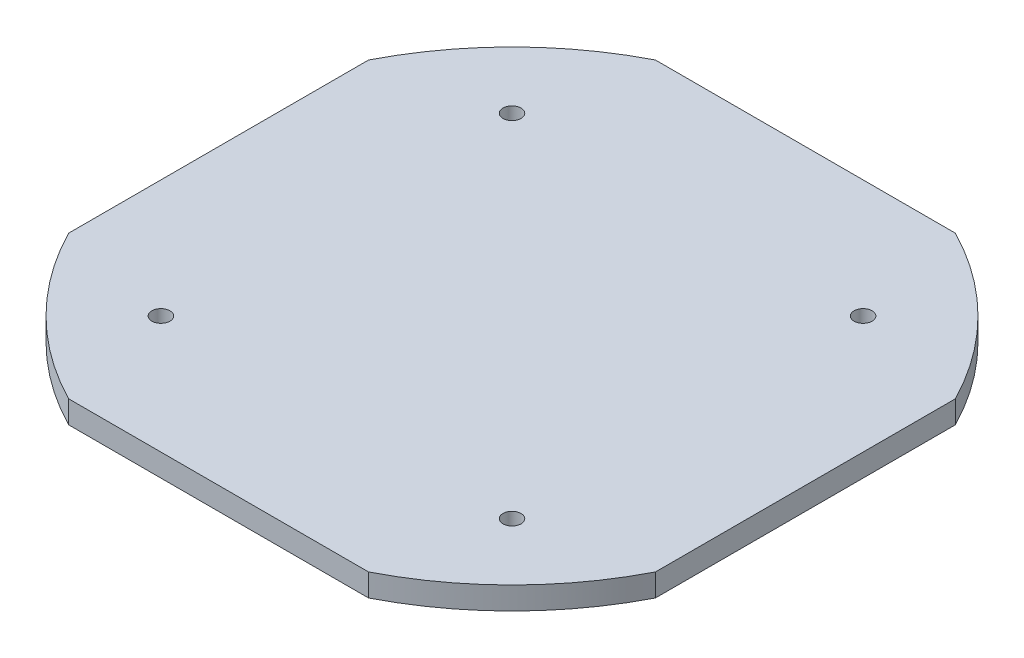
ISO-10303-21;
HEADER;
FILE_DESCRIPTION(('STEP AP214'),'2;1');
FILE_NAME('part.step','',(''),(''),'','','');
FILE_SCHEMA(('AUTOMOTIVE_DESIGN { 1 0 10303 214 1 1 1 1 }'));
ENDSEC;
DATA;
#1=APPLICATION_CONTEXT('core data for automotive mechanical design processes');
#2=APPLICATION_PROTOCOL_DEFINITION('international standard','automotive_design',2000,#1);
#3=PRODUCT_CONTEXT('',#1,'mechanical');
#4=PRODUCT('Part','Part','',(#3));
#5=PRODUCT_RELATED_PRODUCT_CATEGORY('part','',(#4));
#6=PRODUCT_DEFINITION_FORMATION('','',#4);
#7=PRODUCT_DEFINITION_CONTEXT('part definition',#1,'design');
#8=PRODUCT_DEFINITION('design','',#6,#7);
#9=PRODUCT_DEFINITION_SHAPE('','',#8);
#10=(LENGTH_UNIT() NAMED_UNIT(*) SI_UNIT(.MILLI.,.METRE.));
#11=(NAMED_UNIT(*) PLANE_ANGLE_UNIT() SI_UNIT($,.RADIAN.));
#12=(NAMED_UNIT(*) SI_UNIT($,.STERADIAN.) SOLID_ANGLE_UNIT());
#13=UNCERTAINTY_MEASURE_WITH_UNIT(LENGTH_MEASURE(1.E-05),#10,'distance_accuracy_value','');
#14=(GEOMETRIC_REPRESENTATION_CONTEXT(3) GLOBAL_UNCERTAINTY_ASSIGNED_CONTEXT((#13)) GLOBAL_UNIT_ASSIGNED_CONTEXT((#10,
#11,#12)) REPRESENTATION_CONTEXT('',''));
#15=CARTESIAN_POINT('',(0.,0.,0.));
#16=DIRECTION('',(0.,0.,1.));
#17=DIRECTION('',(1.,0.,0.));
#18=AXIS2_PLACEMENT_3D('',#15,#16,#17);
#19=CARTESIAN_POINT('',(0.,5.,0.));
#20=DIRECTION('',(0.,-1.,0.));
#21=DIRECTION('',(0.,0.,-1.));
#22=AXIS2_PLACEMENT_3D('',#19,#20,#21);
#23=CYLINDRICAL_SURFACE('',#22,73.);
#24=CARTESIAN_POINT('',(0.,0.,0.));
#25=DIRECTION('',(0.,1.,0.));
#26=DIRECTION('',(0.,0.,1.));
#27=AXIS2_PLACEMENT_3D('',#24,#25,#26);
#28=CIRCLE('',#27,73.);
#29=CARTESIAN_POINT('',(33.2264954516723,0.,65.));
#30=VERTEX_POINT('',#29);
#31=CARTESIAN_POINT('',(65.,0.,33.2264954516723));
#32=VERTEX_POINT('',#31);
#33=EDGE_CURVE('E133',#30,#32,#28,.T.);
#34=ORIENTED_EDGE('',*,*,#33,.T.);
#35=DIRECTION('',(0.,-1.,0.));
#36=VECTOR('',#35,1.);
#37=CARTESIAN_POINT('',(65.,5.,33.2264954516723));
#38=LINE('',#37,#36);
#39=CARTESIAN_POINT('',(65.,5.,33.2264954516723));
#40=VERTEX_POINT('',#39);
#41=EDGE_CURVE('E11',#40,#32,#38,.T.);
#42=ORIENTED_EDGE('',*,*,#41,.F.);
#43=CARTESIAN_POINT('',(0.,5.,0.));
#44=DIRECTION('',(0.,1.,0.));
#45=DIRECTION('',(0.,0.,1.));
#46=AXIS2_PLACEMENT_3D('',#43,#44,#45);
#47=CIRCLE('',#46,73.);
#48=CARTESIAN_POINT('',(33.2264954516723,5.,65.));
#49=VERTEX_POINT('',#48);
#50=EDGE_CURVE('E148',#49,#40,#47,.T.);
#51=ORIENTED_EDGE('',*,*,#50,.F.);
#52=DIRECTION('',(0.,-1.,0.));
#53=VECTOR('',#52,1.);
#54=CARTESIAN_POINT('',(33.2264954516723,5.,65.));
#55=LINE('',#54,#53);
#56=EDGE_CURVE('E129',#49,#30,#55,.T.);
#57=ORIENTED_EDGE('',*,*,#56,.T.);
#58=EDGE_LOOP('',(#34,#42,#51,#57));
#59=FACE_BOUND('',#58,.T.);
#60=ADVANCED_FACE('F37',(#59),#23,.T.);
#61=CARTESIAN_POINT('',(65.,5.,-33.2264954516723));
#62=DIRECTION('',(-1.,0.,0.));
#63=DIRECTION('',(0.,0.,1.));
#64=AXIS2_PLACEMENT_3D('',#61,#62,#63);
#65=PLANE('',#64);
#66=DIRECTION('',(0.,0.,-1.));
#67=VECTOR('',#66,1.);
#68=CARTESIAN_POINT('',(65.,0.,-33.2264954516723));
#69=LINE('',#68,#67);
#70=CARTESIAN_POINT('',(65.,0.,-33.2264954516723));
#71=VERTEX_POINT('',#70);
#72=EDGE_CURVE('E136',#32,#71,#69,.T.);
#73=ORIENTED_EDGE('',*,*,#72,.T.);
#74=DIRECTION('',(0.,-1.,0.));
#75=VECTOR('',#74,1.);
#76=CARTESIAN_POINT('',(65.,5.,-33.2264954516723));
#77=LINE('',#76,#75);
#78=CARTESIAN_POINT('',(65.,5.,-33.2264954516723));
#79=VERTEX_POINT('',#78);
#80=EDGE_CURVE('E45',#79,#71,#77,.T.);
#81=ORIENTED_EDGE('',*,*,#80,.F.);
#82=DIRECTION('',(0.,0.,-1.));
#83=VECTOR('',#82,1.);
#84=CARTESIAN_POINT('',(65.,5.,-33.2264954516723));
#85=LINE('',#84,#83);
#86=EDGE_CURVE('E96',#40,#79,#85,.T.);
#87=ORIENTED_EDGE('',*,*,#86,.F.);
#88=ORIENTED_EDGE('',*,*,#41,.T.);
#89=EDGE_LOOP('',(#73,#81,#87,#88));
#90=FACE_BOUND('',#89,.T.);
#91=ADVANCED_FACE('F233',(#90),#65,.F.);
#92=CARTESIAN_POINT('',(0.,5.,0.));
#93=DIRECTION('',(0.,-1.,0.));
#94=DIRECTION('',(0.,0.,-1.));
#95=AXIS2_PLACEMENT_3D('',#92,#93,#94);
#96=CYLINDRICAL_SURFACE('',#95,73.);
#97=CARTESIAN_POINT('',(0.,0.,0.));
#98=DIRECTION('',(0.,1.,0.));
#99=DIRECTION('',(0.,0.,1.));
#100=AXIS2_PLACEMENT_3D('',#97,#98,#99);
#101=CIRCLE('',#100,73.);
#102=CARTESIAN_POINT('',(33.2264954516723,0.,-65.));
#103=VERTEX_POINT('',#102);
#104=EDGE_CURVE('E139',#71,#103,#101,.T.);
#105=ORIENTED_EDGE('',*,*,#104,.T.);
#106=DIRECTION('',(0.,-1.,0.));
#107=VECTOR('',#106,1.);
#108=CARTESIAN_POINT('',(33.2264954516723,5.,-65.));
#109=LINE('',#108,#107);
#110=CARTESIAN_POINT('',(33.2264954516723,5.,-65.));
#111=VERTEX_POINT('',#110);
#112=EDGE_CURVE('E155',#111,#103,#109,.T.);
#113=ORIENTED_EDGE('',*,*,#112,.F.);
#114=CARTESIAN_POINT('',(0.,5.,0.));
#115=DIRECTION('',(0.,1.,0.));
#116=DIRECTION('',(0.,0.,1.));
#117=AXIS2_PLACEMENT_3D('',#114,#115,#116);
#118=CIRCLE('',#117,73.);
#119=EDGE_CURVE('E163',#79,#111,#118,.T.);
#120=ORIENTED_EDGE('',*,*,#119,.F.);
#121=ORIENTED_EDGE('',*,*,#80,.T.);
#122=EDGE_LOOP('',(#105,#113,#120,#121));
#123=FACE_BOUND('',#122,.T.);
#124=ADVANCED_FACE('F161',(#123),#96,.T.);
#125=CARTESIAN_POINT('',(-33.2264954516723,5.,-65.));
#126=DIRECTION('',(0.,0.,1.));
#127=DIRECTION('',(1.,0.,0.));
#128=AXIS2_PLACEMENT_3D('',#125,#126,#127);
#129=PLANE('',#128);
#130=DIRECTION('',(-1.,0.,0.));
#131=VECTOR('',#130,1.);
#132=CARTESIAN_POINT('',(-33.2264954516723,0.,-65.));
#133=LINE('',#132,#131);
#134=CARTESIAN_POINT('',(-33.2264954516723,0.,-65.));
#135=VERTEX_POINT('',#134);
#136=EDGE_CURVE('E141',#103,#135,#133,.T.);
#137=ORIENTED_EDGE('',*,*,#136,.T.);
#138=DIRECTION('',(0.,-1.,0.));
#139=VECTOR('',#138,1.);
#140=CARTESIAN_POINT('',(-33.2264954516723,5.,-65.));
#141=LINE('',#140,#139);
#142=CARTESIAN_POINT('',(-33.2264954516723,5.,-65.));
#143=VERTEX_POINT('',#142);
#144=EDGE_CURVE('E152',#143,#135,#141,.T.);
#145=ORIENTED_EDGE('',*,*,#144,.F.);
#146=DIRECTION('',(-1.,0.,0.));
#147=VECTOR('',#146,1.);
#148=CARTESIAN_POINT('',(-33.2264954516723,5.,-65.));
#149=LINE('',#148,#147);
#150=EDGE_CURVE('E175',#111,#143,#149,.T.);
#151=ORIENTED_EDGE('',*,*,#150,.F.);
#152=ORIENTED_EDGE('',*,*,#112,.T.);
#153=EDGE_LOOP('',(#137,#145,#151,#152));
#154=FACE_BOUND('',#153,.T.);
#155=ADVANCED_FACE('F171',(#154),#129,.F.);
#156=CARTESIAN_POINT('',(0.,5.,0.));
#157=DIRECTION('',(0.,-1.,0.));
#158=DIRECTION('',(0.,0.,-1.));
#159=AXIS2_PLACEMENT_3D('',#156,#157,#158);
#160=CYLINDRICAL_SURFACE('',#159,73.);
#161=CARTESIAN_POINT('',(0.,0.,0.));
#162=DIRECTION('',(0.,1.,0.));
#163=DIRECTION('',(0.,0.,1.));
#164=AXIS2_PLACEMENT_3D('',#161,#162,#163);
#165=CIRCLE('',#164,73.);
#166=CARTESIAN_POINT('',(-65.,0.,-33.2264954516723));
#167=VERTEX_POINT('',#166);
#168=EDGE_CURVE('E143',#135,#167,#165,.T.);
#169=ORIENTED_EDGE('',*,*,#168,.T.);
#170=DIRECTION('',(0.,-1.,0.));
#171=VECTOR('',#170,1.);
#172=CARTESIAN_POINT('',(-65.,5.,-33.2264954516723));
#173=LINE('',#172,#171);
#174=CARTESIAN_POINT('',(-65.,5.,-33.2264954516723));
#175=VERTEX_POINT('',#174);
#176=EDGE_CURVE('E124',#175,#167,#173,.T.);
#177=ORIENTED_EDGE('',*,*,#176,.F.);
#178=CARTESIAN_POINT('',(0.,5.,0.));
#179=DIRECTION('',(0.,1.,0.));
#180=DIRECTION('',(0.,0.,1.));
#181=AXIS2_PLACEMENT_3D('',#178,#179,#180);
#182=CIRCLE('',#181,73.);
#183=EDGE_CURVE('E115',#143,#175,#182,.T.);
#184=ORIENTED_EDGE('',*,*,#183,.F.);
#185=ORIENTED_EDGE('',*,*,#144,.T.);
#186=EDGE_LOOP('',(#169,#177,#184,#185));
#187=FACE_BOUND('',#186,.T.);
#188=ADVANCED_FACE('F174',(#187),#160,.T.);
#189=CARTESIAN_POINT('',(-65.,5.,33.2264954516723));
#190=DIRECTION('',(1.,0.,0.));
#191=DIRECTION('',(0.,0.,-1.));
#192=AXIS2_PLACEMENT_3D('',#189,#190,#191);
#193=PLANE('',#192);
#194=DIRECTION('',(0.,0.,1.));
#195=VECTOR('',#194,1.);
#196=CARTESIAN_POINT('',(-65.,0.,33.2264954516723));
#197=LINE('',#196,#195);
#198=CARTESIAN_POINT('',(-65.,0.,33.2264954516723));
#199=VERTEX_POINT('',#198);
#200=EDGE_CURVE('E123',#167,#199,#197,.T.);
#201=ORIENTED_EDGE('',*,*,#200,.T.);
#202=DIRECTION('',(0.,-1.,0.));
#203=VECTOR('',#202,1.);
#204=CARTESIAN_POINT('',(-65.,5.,33.2264954516723));
#205=LINE('',#204,#203);
#206=CARTESIAN_POINT('',(-65.,5.,33.2264954516723));
#207=VERTEX_POINT('',#206);
#208=EDGE_CURVE('E120',#207,#199,#205,.T.);
#209=ORIENTED_EDGE('',*,*,#208,.F.);
#210=DIRECTION('',(0.,0.,1.));
#211=VECTOR('',#210,1.);
#212=CARTESIAN_POINT('',(-65.,5.,33.2264954516723));
#213=LINE('',#212,#211);
#214=EDGE_CURVE('E109',#175,#207,#213,.T.);
#215=ORIENTED_EDGE('',*,*,#214,.F.);
#216=ORIENTED_EDGE('',*,*,#176,.T.);
#217=EDGE_LOOP('',(#201,#209,#215,#216));
#218=FACE_BOUND('',#217,.T.);
#219=ADVANCED_FACE('F121',(#218),#193,.F.);
#220=CARTESIAN_POINT('',(0.,5.,0.));
#221=DIRECTION('',(0.,-1.,0.));
#222=DIRECTION('',(0.,0.,-1.));
#223=AXIS2_PLACEMENT_3D('',#220,#221,#222);
#224=CYLINDRICAL_SURFACE('',#223,73.);
#225=CARTESIAN_POINT('',(0.,0.,0.));
#226=DIRECTION('',(0.,1.,0.));
#227=DIRECTION('',(0.,0.,1.));
#228=AXIS2_PLACEMENT_3D('',#225,#226,#227);
#229=CIRCLE('',#228,73.);
#230=CARTESIAN_POINT('',(-33.2264954516723,0.,65.));
#231=VERTEX_POINT('',#230);
#232=EDGE_CURVE('E82',#199,#231,#229,.T.);
#233=ORIENTED_EDGE('',*,*,#232,.T.);
#234=DIRECTION('',(0.,-1.,0.));
#235=VECTOR('',#234,1.);
#236=CARTESIAN_POINT('',(-33.2264954516723,5.,65.));
#237=LINE('',#236,#235);
#238=CARTESIAN_POINT('',(-33.2264954516723,5.,65.));
#239=VERTEX_POINT('',#238);
#240=EDGE_CURVE('E125',#239,#231,#237,.T.);
#241=ORIENTED_EDGE('',*,*,#240,.F.);
#242=CARTESIAN_POINT('',(0.,5.,0.));
#243=DIRECTION('',(0.,1.,0.));
#244=DIRECTION('',(0.,0.,1.));
#245=AXIS2_PLACEMENT_3D('',#242,#243,#244);
#246=CIRCLE('',#245,73.);
#247=EDGE_CURVE('E113',#207,#239,#246,.T.);
#248=ORIENTED_EDGE('',*,*,#247,.F.);
#249=ORIENTED_EDGE('',*,*,#208,.T.);
#250=EDGE_LOOP('',(#233,#241,#248,#249));
#251=FACE_BOUND('',#250,.T.);
#252=ADVANCED_FACE('F127',(#251),#224,.T.);
#253=CARTESIAN_POINT('',(33.2264954516723,5.,65.));
#254=DIRECTION('',(0.,0.,-1.));
#255=DIRECTION('',(-1.,0.,0.));
#256=AXIS2_PLACEMENT_3D('',#253,#254,#255);
#257=PLANE('',#256);
#258=DIRECTION('',(1.,0.,0.));
#259=VECTOR('',#258,1.);
#260=CARTESIAN_POINT('',(33.2264954516723,0.,65.));
#261=LINE('',#260,#259);
#262=EDGE_CURVE('E88',#231,#30,#261,.T.);
#263=ORIENTED_EDGE('',*,*,#262,.T.);
#264=ORIENTED_EDGE('',*,*,#56,.F.);
#265=DIRECTION('',(1.,0.,0.));
#266=VECTOR('',#265,1.);
#267=CARTESIAN_POINT('',(33.2264954516723,5.,65.));
#268=LINE('',#267,#266);
#269=EDGE_CURVE('E53',#239,#49,#268,.T.);
#270=ORIENTED_EDGE('',*,*,#269,.F.);
#271=ORIENTED_EDGE('',*,*,#240,.T.);
#272=EDGE_LOOP('',(#263,#264,#270,#271));
#273=FACE_BOUND('',#272,.T.);
#274=ADVANCED_FACE('F209',(#273),#257,.F.);
#275=CARTESIAN_POINT('',(0.,5.,0.));
#276=DIRECTION('',(0.,1.,0.));
#277=DIRECTION('',(0.,0.,1.));
#278=AXIS2_PLACEMENT_3D('',#275,#276,#277);
#279=PLANE('',#278);
#280=CARTESIAN_POINT('',(38.8908729652599,5.,-38.8908729652603));
#281=DIRECTION('',(0.,1.,0.));
#282=DIRECTION('',(0.,0.,1.));
#283=AXIS2_PLACEMENT_3D('',#280,#281,#282);
#284=CIRCLE('',#283,1.99999999999999);
#285=CARTESIAN_POINT('',(38.8908729652599,5.,-36.8908729652603));
#286=VERTEX_POINT('',#285);
#287=EDGE_CURVE('E201',#286,#286,#284,.T.);
#288=ORIENTED_EDGE('',*,*,#287,.F.);
#289=EDGE_LOOP('',(#288));
#290=FACE_BOUND('',#289,.T.);
#291=CARTESIAN_POINT('',(38.8908729652603,5.,38.8908729652599));
#292=DIRECTION('',(0.,1.,0.));
#293=DIRECTION('',(0.,0.,1.));
#294=AXIS2_PLACEMENT_3D('',#291,#292,#293);
#295=CIRCLE('',#294,1.99999999999999);
#296=CARTESIAN_POINT('',(38.8908729652603,5.,40.8908729652599));
#297=VERTEX_POINT('',#296);
#298=EDGE_CURVE('E195',#297,#297,#295,.T.);
#299=ORIENTED_EDGE('',*,*,#298,.F.);
#300=EDGE_LOOP('',(#299));
#301=FACE_BOUND('',#300,.T.);
#302=CARTESIAN_POINT('',(-38.8908729652599,5.,38.8908729652603));
#303=DIRECTION('',(0.,1.,0.));
#304=DIRECTION('',(0.,0.,1.));
#305=AXIS2_PLACEMENT_3D('',#302,#303,#304);
#306=CIRCLE('',#305,1.99999999999999);
#307=CARTESIAN_POINT('',(-38.8908729652599,5.,40.8908729652603));
#308=VERTEX_POINT('',#307);
#309=EDGE_CURVE('E189',#308,#308,#306,.T.);
#310=ORIENTED_EDGE('',*,*,#309,.F.);
#311=EDGE_LOOP('',(#310));
#312=FACE_BOUND('',#311,.T.);
#313=CARTESIAN_POINT('',(-38.8908729652603,5.,-38.8908729652599));
#314=DIRECTION('',(0.,1.,0.));
#315=DIRECTION('',(0.,0.,1.));
#316=AXIS2_PLACEMENT_3D('',#313,#314,#315);
#317=CIRCLE('',#316,1.99999999999999);
#318=CARTESIAN_POINT('',(-38.8908729652603,5.,-36.8908729652599));
#319=VERTEX_POINT('',#318);
#320=EDGE_CURVE('E183',#319,#319,#317,.T.);
#321=ORIENTED_EDGE('',*,*,#320,.F.);
#322=EDGE_LOOP('',(#321));
#323=FACE_BOUND('',#322,.T.);
#324=ORIENTED_EDGE('',*,*,#50,.T.);
#325=ORIENTED_EDGE('',*,*,#86,.T.);
#326=ORIENTED_EDGE('',*,*,#119,.T.);
#327=ORIENTED_EDGE('',*,*,#150,.T.);
#328=ORIENTED_EDGE('',*,*,#183,.T.);
#329=ORIENTED_EDGE('',*,*,#214,.T.);
#330=ORIENTED_EDGE('',*,*,#247,.T.);
#331=ORIENTED_EDGE('',*,*,#269,.T.);
#332=EDGE_LOOP('',(#324,#325,#326,#327,#328,#329,#330,#331));
#333=FACE_BOUND('',#332,.T.);
#334=ADVANCED_FACE('F111',(#290,#301,#312,#323,#333),#279,.T.);
#335=CARTESIAN_POINT('',(0.,0.,0.));
#336=DIRECTION('',(0.,1.,0.));
#337=DIRECTION('',(0.,0.,1.));
#338=AXIS2_PLACEMENT_3D('',#335,#336,#337);
#339=PLANE('',#338);
#340=CARTESIAN_POINT('',(38.8908729652599,0.,-38.8908729652603));
#341=DIRECTION('',(0.,1.,0.));
#342=DIRECTION('',(0.,0.,1.));
#343=AXIS2_PLACEMENT_3D('',#340,#341,#342);
#344=CIRCLE('',#343,1.99999999999999);
#345=CARTESIAN_POINT('',(38.8908729652599,0.,-36.8908729652603));
#346=VERTEX_POINT('',#345);
#347=EDGE_CURVE('E198',#346,#346,#344,.T.);
#348=ORIENTED_EDGE('',*,*,#347,.T.);
#349=EDGE_LOOP('',(#348));
#350=FACE_BOUND('',#349,.T.);
#351=CARTESIAN_POINT('',(38.8908729652603,0.,38.8908729652599));
#352=DIRECTION('',(0.,1.,0.));
#353=DIRECTION('',(0.,0.,1.));
#354=AXIS2_PLACEMENT_3D('',#351,#352,#353);
#355=CIRCLE('',#354,1.99999999999999);
#356=CARTESIAN_POINT('',(38.8908729652603,0.,40.8908729652599));
#357=VERTEX_POINT('',#356);
#358=EDGE_CURVE('E192',#357,#357,#355,.T.);
#359=ORIENTED_EDGE('',*,*,#358,.T.);
#360=EDGE_LOOP('',(#359));
#361=FACE_BOUND('',#360,.T.);
#362=CARTESIAN_POINT('',(-38.8908729652599,0.,38.8908729652603));
#363=DIRECTION('',(0.,1.,0.));
#364=DIRECTION('',(0.,0.,1.));
#365=AXIS2_PLACEMENT_3D('',#362,#363,#364);
#366=CIRCLE('',#365,1.99999999999999);
#367=CARTESIAN_POINT('',(-38.8908729652599,0.,40.8908729652603));
#368=VERTEX_POINT('',#367);
#369=EDGE_CURVE('E186',#368,#368,#366,.T.);
#370=ORIENTED_EDGE('',*,*,#369,.T.);
#371=EDGE_LOOP('',(#370));
#372=FACE_BOUND('',#371,.T.);
#373=CARTESIAN_POINT('',(-38.8908729652603,0.,-38.8908729652599));
#374=DIRECTION('',(0.,1.,0.));
#375=DIRECTION('',(0.,0.,1.));
#376=AXIS2_PLACEMENT_3D('',#373,#374,#375);
#377=CIRCLE('',#376,1.99999999999999);
#378=CARTESIAN_POINT('',(-38.8908729652603,0.,-36.8908729652599));
#379=VERTEX_POINT('',#378);
#380=EDGE_CURVE('E137',#379,#379,#377,.T.);
#381=ORIENTED_EDGE('',*,*,#380,.T.);
#382=EDGE_LOOP('',(#381));
#383=FACE_BOUND('',#382,.T.);
#384=ORIENTED_EDGE('',*,*,#33,.F.);
#385=ORIENTED_EDGE('',*,*,#262,.F.);
#386=ORIENTED_EDGE('',*,*,#232,.F.);
#387=ORIENTED_EDGE('',*,*,#200,.F.);
#388=ORIENTED_EDGE('',*,*,#168,.F.);
#389=ORIENTED_EDGE('',*,*,#136,.F.);
#390=ORIENTED_EDGE('',*,*,#104,.F.);
#391=ORIENTED_EDGE('',*,*,#72,.F.);
#392=EDGE_LOOP('',(#384,#385,#386,#387,#388,#389,#390,#391));
#393=FACE_BOUND('',#392,.T.);
#394=ADVANCED_FACE('F167',(#350,#361,#372,#383,#393),#339,.F.);
#395=CARTESIAN_POINT('',(-38.8908729652603,5.,-38.8908729652599));
#396=DIRECTION('',(0.,1.,0.));
#397=DIRECTION('',(0.,0.,1.));
#398=AXIS2_PLACEMENT_3D('',#395,#396,#397);
#399=CYLINDRICAL_SURFACE('',#398,1.99999999999999);
#400=ORIENTED_EDGE('',*,*,#380,.F.);
#401=EDGE_LOOP('',(#400));
#402=FACE_BOUND('',#401,.T.);
#403=ORIENTED_EDGE('',*,*,#320,.T.);
#404=EDGE_LOOP('',(#403));
#405=FACE_BOUND('',#404,.T.);
#406=ADVANCED_FACE('F217',(#402,#405),#399,.F.);
#407=CARTESIAN_POINT('',(-38.8908729652599,5.,38.8908729652603));
#408=DIRECTION('',(0.,1.,0.));
#409=DIRECTION('',(0.,0.,1.));
#410=AXIS2_PLACEMENT_3D('',#407,#408,#409);
#411=CYLINDRICAL_SURFACE('',#410,1.99999999999999);
#412=ORIENTED_EDGE('',*,*,#369,.F.);
#413=EDGE_LOOP('',(#412));
#414=FACE_BOUND('',#413,.T.);
#415=ORIENTED_EDGE('',*,*,#309,.T.);
#416=EDGE_LOOP('',(#415));
#417=FACE_BOUND('',#416,.T.);
#418=ADVANCED_FACE('F219',(#414,#417),#411,.F.);
#419=CARTESIAN_POINT('',(38.8908729652603,5.,38.8908729652599));
#420=DIRECTION('',(0.,1.,0.));
#421=DIRECTION('',(0.,0.,1.));
#422=AXIS2_PLACEMENT_3D('',#419,#420,#421);
#423=CYLINDRICAL_SURFACE('',#422,1.99999999999999);
#424=ORIENTED_EDGE('',*,*,#358,.F.);
#425=EDGE_LOOP('',(#424));
#426=FACE_BOUND('',#425,.T.);
#427=ORIENTED_EDGE('',*,*,#298,.T.);
#428=EDGE_LOOP('',(#427));
#429=FACE_BOUND('',#428,.T.);
#430=ADVANCED_FACE('F226',(#426,#429),#423,.F.);
#431=CARTESIAN_POINT('',(38.8908729652599,5.,-38.8908729652603));
#432=DIRECTION('',(0.,1.,0.));
#433=DIRECTION('',(0.,0.,1.));
#434=AXIS2_PLACEMENT_3D('',#431,#432,#433);
#435=CYLINDRICAL_SURFACE('',#434,1.99999999999999);
#436=ORIENTED_EDGE('',*,*,#347,.F.);
#437=EDGE_LOOP('',(#436));
#438=FACE_BOUND('',#437,.T.);
#439=ORIENTED_EDGE('',*,*,#287,.T.);
#440=EDGE_LOOP('',(#439));
#441=FACE_BOUND('',#440,.T.);
#442=ADVANCED_FACE('F205',(#438,#441),#435,.F.);
#443=CLOSED_SHELL('',(#60,#91,#124,#155,#188,#219,#252,#274,#334,#394,#406,#418,#430,#442));
#444=MANIFOLD_SOLID_BREP('B2',#443);
#445=ADVANCED_BREP_SHAPE_REPRESENTATION('',(#18,#444),#14);
#446=SHAPE_DEFINITION_REPRESENTATION(#9,#445);
ENDSEC;
END-ISO-10303-21;
